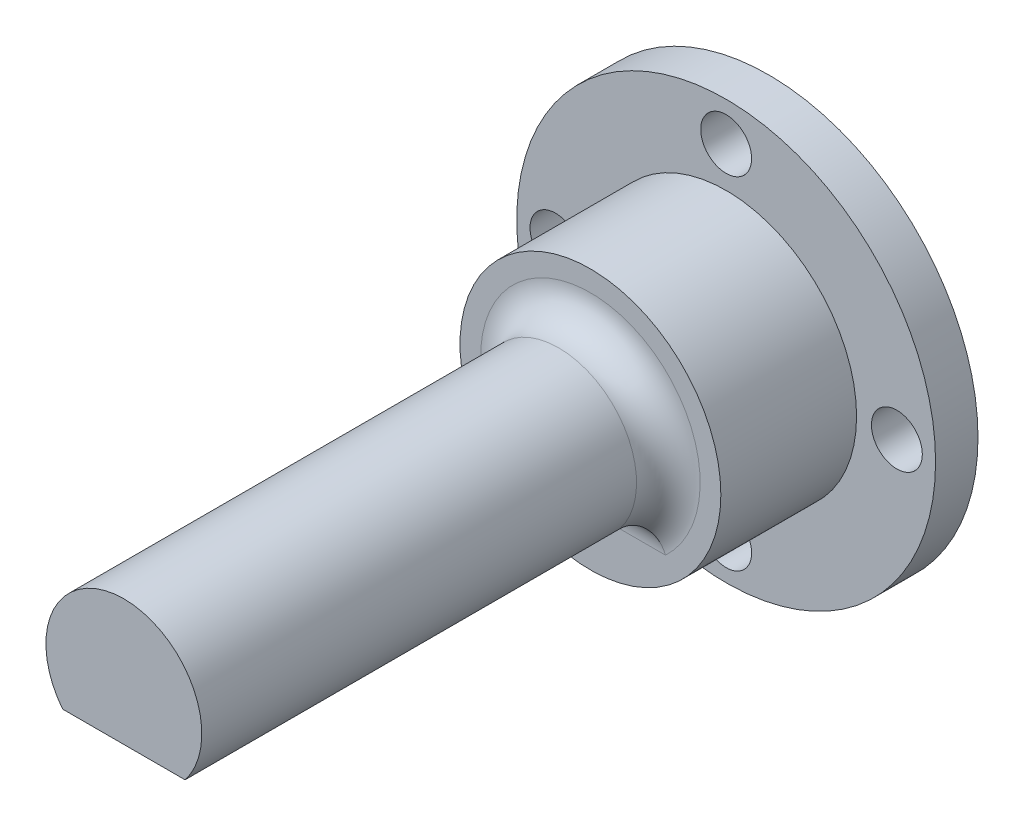
ISO-10303-21;
HEADER;
FILE_DESCRIPTION(('STEP AP214'),'2;1');
FILE_NAME('part.step','',(''),(''),'','','');
FILE_SCHEMA(('AUTOMOTIVE_DESIGN { 1 0 10303 214 1 1 1 1 }'));
ENDSEC;
DATA;
#1=APPLICATION_CONTEXT('core data for automotive mechanical design processes');
#2=APPLICATION_PROTOCOL_DEFINITION('international standard','automotive_design',2000,#1);
#3=PRODUCT_CONTEXT('',#1,'mechanical');
#4=PRODUCT('Part','Part','',(#3));
#5=PRODUCT_RELATED_PRODUCT_CATEGORY('part','',(#4));
#6=PRODUCT_DEFINITION_FORMATION('','',#4);
#7=PRODUCT_DEFINITION_CONTEXT('part definition',#1,'design');
#8=PRODUCT_DEFINITION('design','',#6,#7);
#9=PRODUCT_DEFINITION_SHAPE('','',#8);
#10=(LENGTH_UNIT() NAMED_UNIT(*) SI_UNIT(.MILLI.,.METRE.));
#11=(NAMED_UNIT(*) PLANE_ANGLE_UNIT() SI_UNIT($,.RADIAN.));
#12=(NAMED_UNIT(*) SI_UNIT($,.STERADIAN.) SOLID_ANGLE_UNIT());
#13=UNCERTAINTY_MEASURE_WITH_UNIT(LENGTH_MEASURE(1.E-05),#10,'distance_accuracy_value','');
#14=(GEOMETRIC_REPRESENTATION_CONTEXT(3) GLOBAL_UNCERTAINTY_ASSIGNED_CONTEXT((#13)) GLOBAL_UNIT_ASSIGNED_CONTEXT((#10,
#11,#12)) REPRESENTATION_CONTEXT('',''));
#15=CARTESIAN_POINT('',(0.,0.,0.));
#16=DIRECTION('',(0.,0.,1.));
#17=DIRECTION('',(1.,0.,0.));
#18=AXIS2_PLACEMENT_3D('',#15,#16,#17);
#19=CARTESIAN_POINT('',(0.,0.,2.));
#20=DIRECTION('',(0.,0.,-1.));
#21=DIRECTION('',(-1.,0.,0.));
#22=AXIS2_PLACEMENT_3D('',#19,#20,#21);
#23=CYLINDRICAL_SURFACE('',#22,9.875);
#24=CARTESIAN_POINT('',(0.,0.,2.));
#25=DIRECTION('',(0.,0.,1.));
#26=DIRECTION('',(1.,0.,0.));
#27=AXIS2_PLACEMENT_3D('',#24,#25,#26);
#28=CIRCLE('',#27,9.875);
#29=CARTESIAN_POINT('',(9.875,0.,2.));
#30=VERTEX_POINT('',#29);
#31=EDGE_CURVE('E111',#30,#30,#28,.T.);
#32=ORIENTED_EDGE('',*,*,#31,.F.);
#33=EDGE_LOOP('',(#32));
#34=FACE_BOUND('',#33,.T.);
#35=CARTESIAN_POINT('',(0.,0.,0.));
#36=DIRECTION('',(0.,0.,1.));
#37=DIRECTION('',(1.,0.,0.));
#38=AXIS2_PLACEMENT_3D('',#35,#36,#37);
#39=CIRCLE('',#38,9.875);
#40=CARTESIAN_POINT('',(9.875,0.,0.));
#41=VERTEX_POINT('',#40);
#42=EDGE_CURVE('E102',#41,#41,#39,.T.);
#43=ORIENTED_EDGE('',*,*,#42,.T.);
#44=EDGE_LOOP('',(#43));
#45=FACE_BOUND('',#44,.T.);
#46=ADVANCED_FACE('F39',(#34,#45),#23,.T.);
#47=CARTESIAN_POINT('',(0.,0.,2.));
#48=DIRECTION('',(0.,0.,1.));
#49=DIRECTION('',(1.,0.,0.));
#50=AXIS2_PLACEMENT_3D('',#47,#48,#49);
#51=PLANE('',#50);
#52=CARTESIAN_POINT('',(0.,8.04534617168867,2.));
#53=DIRECTION('',(0.,0.,1.));
#54=DIRECTION('',(1.,0.,0.));
#55=AXIS2_PLACEMENT_3D('',#52,#53,#54);
#56=CIRCLE('',#55,1.2);
#57=CARTESIAN_POINT('',(1.2,8.04534617168867,2.));
#58=VERTEX_POINT('',#57);
#59=EDGE_CURVE('E185',#58,#58,#56,.T.);
#60=ORIENTED_EDGE('',*,*,#59,.F.);
#61=EDGE_LOOP('',(#60));
#62=FACE_BOUND('',#61,.T.);
#63=CARTESIAN_POINT('',(0.,-8.05465382831133,2.));
#64=DIRECTION('',(0.,0.,1.));
#65=DIRECTION('',(1.,0.,0.));
#66=AXIS2_PLACEMENT_3D('',#63,#64,#65);
#67=CIRCLE('',#66,1.2);
#68=CARTESIAN_POINT('',(1.2,-8.05465382831133,2.));
#69=VERTEX_POINT('',#68);
#70=EDGE_CURVE('E193',#69,#69,#67,.T.);
#71=ORIENTED_EDGE('',*,*,#70,.F.);
#72=EDGE_LOOP('',(#71));
#73=FACE_BOUND('',#72,.T.);
#74=CARTESIAN_POINT('',(-8.05,0.,2.));
#75=DIRECTION('',(0.,0.,1.));
#76=DIRECTION('',(1.,0.,0.));
#77=AXIS2_PLACEMENT_3D('',#74,#75,#76);
#78=CIRCLE('',#77,1.2);
#79=CARTESIAN_POINT('',(-6.85,0.,2.));
#80=VERTEX_POINT('',#79);
#81=EDGE_CURVE('E203',#80,#80,#78,.T.);
#82=ORIENTED_EDGE('',*,*,#81,.F.);
#83=EDGE_LOOP('',(#82));
#84=FACE_BOUND('',#83,.T.);
#85=CARTESIAN_POINT('',(8.05,0.,2.));
#86=DIRECTION('',(0.,0.,1.));
#87=DIRECTION('',(1.,0.,0.));
#88=AXIS2_PLACEMENT_3D('',#85,#86,#87);
#89=CIRCLE('',#88,1.2);
#90=CARTESIAN_POINT('',(9.25,0.,2.));
#91=VERTEX_POINT('',#90);
#92=EDGE_CURVE('E211',#91,#91,#89,.T.);
#93=ORIENTED_EDGE('',*,*,#92,.F.);
#94=EDGE_LOOP('',(#93));
#95=FACE_BOUND('',#94,.T.);
#96=CARTESIAN_POINT('',(0.,0.,2.));
#97=DIRECTION('',(0.,0.,1.));
#98=DIRECTION('',(1.,0.,0.));
#99=AXIS2_PLACEMENT_3D('',#96,#97,#98);
#100=CIRCLE('',#99,6.15);
#101=CARTESIAN_POINT('',(6.15,0.,2.));
#102=VERTEX_POINT('',#101);
#103=EDGE_CURVE('E106',#102,#102,#100,.T.);
#104=ORIENTED_EDGE('',*,*,#103,.F.);
#105=EDGE_LOOP('',(#104));
#106=FACE_BOUND('',#105,.T.);
#107=ORIENTED_EDGE('',*,*,#31,.T.);
#108=EDGE_LOOP('',(#107));
#109=FACE_BOUND('',#108,.T.);
#110=ADVANCED_FACE('F138',(#62,#73,#84,#95,#106,#109),#51,.T.);
#111=CARTESIAN_POINT('',(0.,0.,0.));
#112=DIRECTION('',(0.,0.,1.));
#113=DIRECTION('',(1.,0.,0.));
#114=AXIS2_PLACEMENT_3D('',#111,#112,#113);
#115=PLANE('',#114);
#116=CARTESIAN_POINT('',(0.,8.04534617168867,0.));
#117=DIRECTION('',(0.,0.,1.));
#118=DIRECTION('',(1.,0.,0.));
#119=AXIS2_PLACEMENT_3D('',#116,#117,#118);
#120=CIRCLE('',#119,1.2);
#121=CARTESIAN_POINT('',(1.2,8.04534617168867,0.));
#122=VERTEX_POINT('',#121);
#123=EDGE_CURVE('E94',#122,#122,#120,.T.);
#124=ORIENTED_EDGE('',*,*,#123,.T.);
#125=EDGE_LOOP('',(#124));
#126=FACE_BOUND('',#125,.T.);
#127=CARTESIAN_POINT('',(0.,-8.05465382831133,0.));
#128=DIRECTION('',(0.,0.,1.));
#129=DIRECTION('',(1.,0.,0.));
#130=AXIS2_PLACEMENT_3D('',#127,#128,#129);
#131=CIRCLE('',#130,1.2);
#132=CARTESIAN_POINT('',(1.2,-8.05465382831133,0.));
#133=VERTEX_POINT('',#132);
#134=EDGE_CURVE('E187',#133,#133,#131,.T.);
#135=ORIENTED_EDGE('',*,*,#134,.T.);
#136=EDGE_LOOP('',(#135));
#137=FACE_BOUND('',#136,.T.);
#138=CARTESIAN_POINT('',(-8.05,0.,0.));
#139=DIRECTION('',(0.,0.,1.));
#140=DIRECTION('',(1.,0.,0.));
#141=AXIS2_PLACEMENT_3D('',#138,#139,#140);
#142=CIRCLE('',#141,1.2);
#143=CARTESIAN_POINT('',(-6.85,0.,0.));
#144=VERTEX_POINT('',#143);
#145=EDGE_CURVE('E199',#144,#144,#142,.T.);
#146=ORIENTED_EDGE('',*,*,#145,.T.);
#147=EDGE_LOOP('',(#146));
#148=FACE_BOUND('',#147,.T.);
#149=CARTESIAN_POINT('',(8.05,0.,0.));
#150=DIRECTION('',(0.,0.,1.));
#151=DIRECTION('',(1.,0.,0.));
#152=AXIS2_PLACEMENT_3D('',#149,#150,#151);
#153=CIRCLE('',#152,1.2);
#154=CARTESIAN_POINT('',(9.25,0.,0.));
#155=VERTEX_POINT('',#154);
#156=EDGE_CURVE('E207',#155,#155,#153,.T.);
#157=ORIENTED_EDGE('',*,*,#156,.T.);
#158=EDGE_LOOP('',(#157));
#159=FACE_BOUND('',#158,.T.);
#160=ORIENTED_EDGE('',*,*,#42,.F.);
#161=EDGE_LOOP('',(#160));
#162=FACE_BOUND('',#161,.T.);
#163=ADVANCED_FACE('F140',(#126,#137,#148,#159,#162),#115,.F.);
#164=CARTESIAN_POINT('',(0.,0.,8.4));
#165=DIRECTION('',(0.,0.,-1.));
#166=DIRECTION('',(-1.,0.,0.));
#167=AXIS2_PLACEMENT_3D('',#164,#165,#166);
#168=CYLINDRICAL_SURFACE('',#167,6.15);
#169=CARTESIAN_POINT('',(0.,0.,8.4));
#170=DIRECTION('',(0.,0.,1.));
#171=DIRECTION('',(1.,0.,0.));
#172=AXIS2_PLACEMENT_3D('',#169,#170,#171);
#173=CIRCLE('',#172,6.15);
#174=CARTESIAN_POINT('',(6.15,0.,8.4));
#175=VERTEX_POINT('',#174);
#176=EDGE_CURVE('E98',#175,#175,#173,.T.);
#177=ORIENTED_EDGE('',*,*,#176,.F.);
#178=EDGE_LOOP('',(#177));
#179=FACE_BOUND('',#178,.T.);
#180=ORIENTED_EDGE('',*,*,#103,.T.);
#181=EDGE_LOOP('',(#180));
#182=FACE_BOUND('',#181,.T.);
#183=ADVANCED_FACE('F143',(#179,#182),#168,.T.);
#184=CARTESIAN_POINT('',(0.,0.,8.4));
#185=DIRECTION('',(0.,0.,1.));
#186=DIRECTION('',(1.,0.,0.));
#187=AXIS2_PLACEMENT_3D('',#184,#185,#186);
#188=PLANE('',#187);
#189=CARTESIAN_POINT('',(0.,0.,8.4));
#190=DIRECTION('',(0.,0.,1.));
#191=DIRECTION('',(1.,0.,0.));
#192=AXIS2_PLACEMENT_3D('',#189,#190,#191);
#193=CIRCLE('',#192,5.175);
#194=CARTESIAN_POINT('',(-3.53977400408557,-3.775,8.4));
#195=VERTEX_POINT('',#194);
#196=CARTESIAN_POINT('',(3.53977400408557,-3.775,8.4));
#197=VERTEX_POINT('',#196);
#198=EDGE_CURVE('E110',#195,#197,#193,.F.);
#199=ORIENTED_EDGE('',*,*,#198,.T.);
#200=DIRECTION('',(-1.,0.,0.));
#201=VECTOR('',#200,1.);
#202=CARTESIAN_POINT('',(0.,-3.775,8.4));
#203=LINE('',#202,#201);
#204=EDGE_CURVE('E120',#197,#195,#203,.T.);
#205=ORIENTED_EDGE('',*,*,#204,.T.);
#206=EDGE_LOOP('',(#199,#205));
#207=FACE_BOUND('',#206,.T.);
#208=ORIENTED_EDGE('',*,*,#176,.T.);
#209=EDGE_LOOP('',(#208));
#210=FACE_BOUND('',#209,.T.);
#211=ADVANCED_FACE('F150',(#207,#210),#188,.T.);
#212=CARTESIAN_POINT('',(0.,0.,30.4));
#213=DIRECTION('',(0.,0.,-1.));
#214=DIRECTION('',(-1.,0.,0.));
#215=AXIS2_PLACEMENT_3D('',#212,#213,#214);
#216=CYLINDRICAL_SURFACE('',#215,3.675);
#217=DIRECTION('',(0.,0.,1.));
#218=VECTOR('',#217,1.);
#219=CARTESIAN_POINT('',(2.88617393793236,-2.275,8.4));
#220=LINE('',#219,#218);
#221=CARTESIAN_POINT('',(2.88617393793236,-2.275,9.9));
#222=VERTEX_POINT('',#221);
#223=CARTESIAN_POINT('',(2.88617393793236,-2.275,30.4));
#224=VERTEX_POINT('',#223);
#225=EDGE_CURVE('E87',#222,#224,#220,.T.);
#226=ORIENTED_EDGE('',*,*,#225,.F.);
#227=CARTESIAN_POINT('',(0.,0.,9.9));
#228=DIRECTION('',(0.,0.,1.));
#229=DIRECTION('',(1.,0.,0.));
#230=AXIS2_PLACEMENT_3D('',#227,#228,#229);
#231=CIRCLE('',#230,3.675);
#232=CARTESIAN_POINT('',(-2.88617393793236,-2.275,9.9));
#233=VERTEX_POINT('',#232);
#234=EDGE_CURVE('E11',#222,#233,#231,.T.);
#235=ORIENTED_EDGE('',*,*,#234,.T.);
#236=DIRECTION('',(0.,0.,1.));
#237=VECTOR('',#236,1.);
#238=CARTESIAN_POINT('',(-2.88617393793236,-2.275,8.4));
#239=LINE('',#238,#237);
#240=CARTESIAN_POINT('',(-2.88617393793236,-2.275,30.4));
#241=VERTEX_POINT('',#240);
#242=EDGE_CURVE('E79',#233,#241,#239,.T.);
#243=ORIENTED_EDGE('',*,*,#242,.T.);
#244=CARTESIAN_POINT('',(0.,0.,30.4));
#245=DIRECTION('',(0.,0.,1.));
#246=DIRECTION('',(1.,0.,0.));
#247=AXIS2_PLACEMENT_3D('',#244,#245,#246);
#248=CIRCLE('',#247,3.675);
#249=EDGE_CURVE('E83',#224,#241,#248,.T.);
#250=ORIENTED_EDGE('',*,*,#249,.F.);
#251=EDGE_LOOP('',(#226,#235,#243,#250));
#252=FACE_BOUND('',#251,.T.);
#253=ADVANCED_FACE('F81',(#252),#216,.T.);
#254=CARTESIAN_POINT('',(0.,0.,30.4));
#255=DIRECTION('',(0.,0.,1.));
#256=DIRECTION('',(1.,0.,0.));
#257=AXIS2_PLACEMENT_3D('',#254,#255,#256);
#258=PLANE('',#257);
#259=DIRECTION('',(-1.,0.,0.));
#260=VECTOR('',#259,1.);
#261=CARTESIAN_POINT('',(-2.88617393793236,-2.275,30.4));
#262=LINE('',#261,#260);
#263=EDGE_CURVE('E90',#224,#241,#262,.T.);
#264=ORIENTED_EDGE('',*,*,#263,.F.);
#265=ORIENTED_EDGE('',*,*,#249,.T.);
#266=EDGE_LOOP('',(#264,#265));
#267=FACE_BOUND('',#266,.T.);
#268=ADVANCED_FACE('F96',(#267),#258,.T.);
#269=CARTESIAN_POINT('',(-2.88617393793236,-2.275,8.4));
#270=DIRECTION('',(0.,1.,0.));
#271=DIRECTION('',(0.,0.,1.));
#272=AXIS2_PLACEMENT_3D('',#269,#270,#271);
#273=PLANE('',#272);
#274=ORIENTED_EDGE('',*,*,#242,.F.);
#275=DIRECTION('',(-1.,0.,0.));
#276=VECTOR('',#275,1.);
#277=CARTESIAN_POINT('',(-2.88617393793236,-2.275,9.9));
#278=LINE('',#277,#276);
#279=EDGE_CURVE('E54',#233,#222,#278,.F.);
#280=ORIENTED_EDGE('',*,*,#279,.T.);
#281=ORIENTED_EDGE('',*,*,#225,.T.);
#282=ORIENTED_EDGE('',*,*,#263,.T.);
#283=EDGE_LOOP('',(#274,#280,#281,#282));
#284=FACE_BOUND('',#283,.T.);
#285=ADVANCED_FACE('F91',(#284),#273,.F.);
#286=CARTESIAN_POINT('',(8.05,0.,0.));
#287=DIRECTION('',(0.,0.,1.));
#288=DIRECTION('',(1.,0.,0.));
#289=AXIS2_PLACEMENT_3D('',#286,#287,#288);
#290=CYLINDRICAL_SURFACE('',#289,1.2);
#291=ORIENTED_EDGE('',*,*,#156,.F.);
#292=EDGE_LOOP('',(#291));
#293=FACE_BOUND('',#292,.T.);
#294=ORIENTED_EDGE('',*,*,#92,.T.);
#295=EDGE_LOOP('',(#294));
#296=FACE_BOUND('',#295,.T.);
#297=ADVANCED_FACE('F161',(#293,#296),#290,.F.);
#298=CARTESIAN_POINT('',(-8.05,0.,0.));
#299=DIRECTION('',(0.,0.,1.));
#300=DIRECTION('',(1.,0.,0.));
#301=AXIS2_PLACEMENT_3D('',#298,#299,#300);
#302=CYLINDRICAL_SURFACE('',#301,1.2);
#303=ORIENTED_EDGE('',*,*,#145,.F.);
#304=EDGE_LOOP('',(#303));
#305=FACE_BOUND('',#304,.T.);
#306=ORIENTED_EDGE('',*,*,#81,.T.);
#307=EDGE_LOOP('',(#306));
#308=FACE_BOUND('',#307,.T.);
#309=ADVANCED_FACE('F164',(#305,#308),#302,.F.);
#310=CARTESIAN_POINT('',(0.,-8.05465382831133,0.));
#311=DIRECTION('',(0.,0.,1.));
#312=DIRECTION('',(1.,0.,0.));
#313=AXIS2_PLACEMENT_3D('',#310,#311,#312);
#314=CYLINDRICAL_SURFACE('',#313,1.2);
#315=ORIENTED_EDGE('',*,*,#134,.F.);
#316=EDGE_LOOP('',(#315));
#317=FACE_BOUND('',#316,.T.);
#318=ORIENTED_EDGE('',*,*,#70,.T.);
#319=EDGE_LOOP('',(#318));
#320=FACE_BOUND('',#319,.T.);
#321=ADVANCED_FACE('F168',(#317,#320),#314,.F.);
#322=CARTESIAN_POINT('',(0.,8.04534617168867,0.));
#323=DIRECTION('',(0.,0.,1.));
#324=DIRECTION('',(1.,0.,0.));
#325=AXIS2_PLACEMENT_3D('',#322,#323,#324);
#326=CYLINDRICAL_SURFACE('',#325,1.2);
#327=ORIENTED_EDGE('',*,*,#123,.F.);
#328=EDGE_LOOP('',(#327));
#329=FACE_BOUND('',#328,.T.);
#330=ORIENTED_EDGE('',*,*,#59,.T.);
#331=EDGE_LOOP('',(#330));
#332=FACE_BOUND('',#331,.T.);
#333=ADVANCED_FACE('F172',(#329,#332),#326,.F.);
#334=CARTESIAN_POINT('',(0.,0.,9.9));
#335=DIRECTION('',(0.,0.,1.));
#336=DIRECTION('',(1.,0.,0.));
#337=AXIS2_PLACEMENT_3D('',#334,#335,#336);
#338=TOROIDAL_SURFACE('',#337,5.175,1.5);
#339=CARTESIAN_POINT('',(-2.88617393793236,-2.275,9.9));
#340=CARTESIAN_POINT('',(-2.88617209016061,-2.27499818892566,9.86065612863859));
#341=CARTESIAN_POINT('',(-2.88692542478848,-2.27654904561077,9.82133255854366));
#342=CARTESIAN_POINT('',(-2.88991788969371,-2.28272214721318,9.74299563178119));
#343=CARTESIAN_POINT('',(-2.89215658036772,-2.28734348339734,9.70398218678568));
#344=CARTESIAN_POINT('',(-2.90103766775295,-2.30570815668435,9.58812668257055));
#345=CARTESIAN_POINT('',(-2.90984556316124,-2.32395287201741,9.51210894240389));
#346=CARTESIAN_POINT('',(-2.93270113974133,-2.37164569442189,9.36464003991987));
#347=CARTESIAN_POINT('',(-2.9467451381405,-2.40108592750215,9.29318570923969));
#348=CARTESIAN_POINT('',(-2.9793259039143,-2.47004228184226,9.15638993769559));
#349=CARTESIAN_POINT('',(-2.99786577560034,-2.50956536609619,9.09105276400173));
#350=CARTESIAN_POINT('',(-3.03951590276426,-2.59935906518393,8.96505446595425));
#351=CARTESIAN_POINT('',(-3.06279529905272,-2.65003580495219,8.90473978690209));
#352=CARTESIAN_POINT('',(-3.11238846562452,-2.75940964623246,8.79335007550278));
#353=CARTESIAN_POINT('',(-3.13870320885695,-2.81810932053438,8.74227801933422));
#354=CARTESIAN_POINT('',(-3.19600889826937,-2.94770699754721,8.64593036243886));
#355=CARTESIAN_POINT('',(-3.22720733934454,-3.01923030788318,8.60161917677724));
#356=CARTESIAN_POINT('',(-3.29116296687356,-3.16811816509262,8.52570785102042));
#357=CARTESIAN_POINT('',(-3.32392080189501,-3.24548515039766,8.49411305237286));
#358=CARTESIAN_POINT('',(-3.38678600354931,-3.39622477982563,8.44667802866235));
#359=CARTESIAN_POINT('',(-3.41683450658198,-3.46923399819938,8.42958726538062));
#360=CARTESIAN_POINT('',(-3.47681475442067,-3.61690888097051,8.40649022595985));
#361=CARTESIAN_POINT('',(-3.50674661066526,-3.69157054849167,8.4004596503962));
#362=CARTESIAN_POINT('',(-3.53747718259093,-3.76919409483318,8.40000840605345));
#363=CARTESIAN_POINT('',(-3.53862586737081,-3.77209702768326,8.39999997728123));
#364=CARTESIAN_POINT('',(-3.53977400408557,-3.775,8.4));
#365=B_SPLINE_CURVE_WITH_KNOTS('',3,(#339,#340,#341,#342,#343,#344,#345,#346,#347,#348,#349,
#350,#351,#352,#353,#354,#355,#356,#357,#358,#359,#360,#361,#362,#363,#364),.UNSPECIFIED.,.F.,
.F.,(4,2,2,2,2,2,2,2,2,2,2,2,4),(0.,0.117954280554516,0.23587366713072,0.470645530737386,
0.70525257991519,0.940022084182778,1.18543866364309,1.43093412860823,1.69899686963025,
1.96717209169816,2.20878395944881,2.44986436290165,2.45923015736385),.UNSPECIFIED.);
#366=EDGE_CURVE('E125',#233,#195,#365,.T.);
#367=ORIENTED_EDGE('',*,*,#366,.F.);
#368=ORIENTED_EDGE('',*,*,#234,.F.);
#369=CARTESIAN_POINT('',(2.88617393793236,-2.275,9.9));
#370=CARTESIAN_POINT('',(2.88617209016061,-2.27499818892566,9.86065612863859));
#371=CARTESIAN_POINT('',(2.88692542478848,-2.27654904561077,9.82133255854366));
#372=CARTESIAN_POINT('',(2.88991788969371,-2.28272214721318,9.74299563178119));
#373=CARTESIAN_POINT('',(2.89215658036772,-2.28734348339734,9.70398218678568));
#374=CARTESIAN_POINT('',(2.90103766775295,-2.30570815668435,9.58812668257055));
#375=CARTESIAN_POINT('',(2.90984556316124,-2.32395287201741,9.51210894240389));
#376=CARTESIAN_POINT('',(2.93270113974133,-2.37164569442189,9.36464003991987));
#377=CARTESIAN_POINT('',(2.9467451381405,-2.40108592750215,9.29318570923969));
#378=CARTESIAN_POINT('',(2.9793259039143,-2.47004228184226,9.15638993769559));
#379=CARTESIAN_POINT('',(2.99786577560034,-2.50956536609619,9.09105276400173));
#380=CARTESIAN_POINT('',(3.03951590276426,-2.59935906518393,8.96505446595425));
#381=CARTESIAN_POINT('',(3.06279529905272,-2.65003580495219,8.90473978690209));
#382=CARTESIAN_POINT('',(3.11238846562452,-2.75940964623246,8.79335007550278));
#383=CARTESIAN_POINT('',(3.13870320885695,-2.81810932053438,8.74227801933422));
#384=CARTESIAN_POINT('',(3.19600889826937,-2.94770699754721,8.64593036243886));
#385=CARTESIAN_POINT('',(3.22720733934454,-3.01923030788318,8.60161917677724));
#386=CARTESIAN_POINT('',(3.29116296687356,-3.16811816509262,8.52570785102042));
#387=CARTESIAN_POINT('',(3.32392080189501,-3.24548515039766,8.49411305237286));
#388=CARTESIAN_POINT('',(3.38678600354931,-3.39622477982563,8.44667802866235));
#389=CARTESIAN_POINT('',(3.41683450658198,-3.46923399819938,8.42958726538062));
#390=CARTESIAN_POINT('',(3.47681475442067,-3.61690888097051,8.40649022595985));
#391=CARTESIAN_POINT('',(3.50674661066526,-3.69157054849167,8.4004596503962));
#392=CARTESIAN_POINT('',(3.53747718259093,-3.76919409483318,8.40000840605345));
#393=CARTESIAN_POINT('',(3.53862586737081,-3.77209702768326,8.39999997728123));
#394=CARTESIAN_POINT('',(3.53977400408557,-3.775,8.4));
#395=B_SPLINE_CURVE_WITH_KNOTS('',3,(#369,#370,#371,#372,#373,#374,#375,#376,#377,#378,#379,
#380,#381,#382,#383,#384,#385,#386,#387,#388,#389,#390,#391,#392,#393,#394),.UNSPECIFIED.,.F.,
.F.,(4,2,2,2,2,2,2,2,2,2,2,2,4),(0.,0.117954280554516,0.23587366713072,0.470645530737386,
0.70525257991519,0.940022084182778,1.18543866364309,1.43093412860823,1.69899686963025,
1.96717209169816,2.20878395944881,2.44986436290165,2.45923015736385),.UNSPECIFIED.);
#396=EDGE_CURVE('E44',#197,#222,#395,.F.);
#397=ORIENTED_EDGE('',*,*,#396,.F.);
#398=ORIENTED_EDGE('',*,*,#198,.F.);
#399=EDGE_LOOP('',(#367,#368,#397,#398));
#400=FACE_BOUND('',#399,.T.);
#401=ADVANCED_FACE('F41',(#400),#338,.F.);
#402=CARTESIAN_POINT('',(0.,-3.775,9.9));
#403=DIRECTION('',(-1.,0.,0.));
#404=DIRECTION('',(0.,0.,1.));
#405=AXIS2_PLACEMENT_3D('',#402,#403,#404);
#406=CYLINDRICAL_SURFACE('',#405,1.5);
#407=ORIENTED_EDGE('',*,*,#396,.T.);
#408=ORIENTED_EDGE('',*,*,#279,.F.);
#409=ORIENTED_EDGE('',*,*,#366,.T.);
#410=ORIENTED_EDGE('',*,*,#204,.F.);
#411=EDGE_LOOP('',(#407,#408,#409,#410));
#412=FACE_BOUND('',#411,.T.);
#413=ADVANCED_FACE('F131',(#412),#406,.F.);
#414=CLOSED_SHELL('',(#46,#110,#163,#183,#211,#253,#268,#285,#297,#309,#321,#333,#401,#413));
#415=MANIFOLD_SOLID_BREP('B2',#414);
#416=ADVANCED_BREP_SHAPE_REPRESENTATION('',(#18,#415),#14);
#417=SHAPE_DEFINITION_REPRESENTATION(#9,#416);
ENDSEC;
END-ISO-10303-21;
